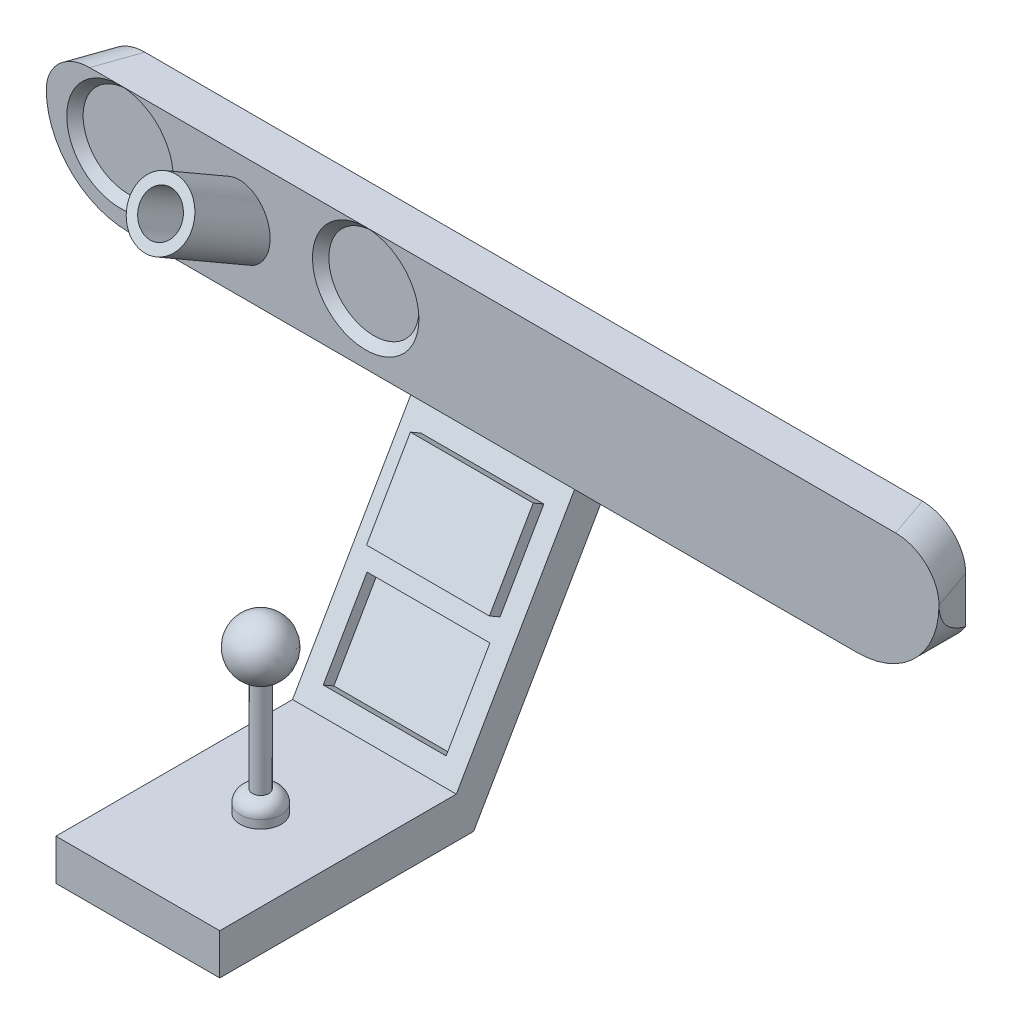
ISO-10303-21;
HEADER;
FILE_DESCRIPTION(('STEP AP214'),'2;1');
FILE_NAME('part.step','',(''),(''),'','','');
FILE_SCHEMA(('AUTOMOTIVE_DESIGN { 1 0 10303 214 1 1 1 1 }'));
ENDSEC;
DATA;
#1=APPLICATION_CONTEXT('core data for automotive mechanical design processes');
#2=APPLICATION_PROTOCOL_DEFINITION('international standard','automotive_design',2000,#1);
#3=PRODUCT_CONTEXT('',#1,'mechanical');
#4=PRODUCT('Part','Part','',(#3));
#5=PRODUCT_RELATED_PRODUCT_CATEGORY('part','',(#4));
#6=PRODUCT_DEFINITION_FORMATION('','',#4);
#7=PRODUCT_DEFINITION_CONTEXT('part definition',#1,'design');
#8=PRODUCT_DEFINITION('design','',#6,#7);
#9=PRODUCT_DEFINITION_SHAPE('','',#8);
#10=(LENGTH_UNIT() NAMED_UNIT(*) SI_UNIT(.MILLI.,.METRE.));
#11=(NAMED_UNIT(*) PLANE_ANGLE_UNIT() SI_UNIT($,.RADIAN.));
#12=(NAMED_UNIT(*) SI_UNIT($,.STERADIAN.) SOLID_ANGLE_UNIT());
#13=UNCERTAINTY_MEASURE_WITH_UNIT(LENGTH_MEASURE(1.E-05),#10,'distance_accuracy_value','');
#14=(GEOMETRIC_REPRESENTATION_CONTEXT(3) GLOBAL_UNCERTAINTY_ASSIGNED_CONTEXT((#13)) GLOBAL_UNIT_ASSIGNED_CONTEXT((#10,
#11,#12)) REPRESENTATION_CONTEXT('',''));
#15=CARTESIAN_POINT('',(0.,0.,0.));
#16=DIRECTION('',(0.,0.,1.));
#17=DIRECTION('',(1.,0.,0.));
#18=AXIS2_PLACEMENT_3D('',#15,#16,#17);
#19=CARTESIAN_POINT('',(20.,-15.,5.));
#20=DIRECTION('',(0.,-0.499999999999998,-0.86602540378444));
#21=DIRECTION('',(0.,0.86602540378444,-0.499999999999998));
#22=AXIS2_PLACEMENT_3D('',#19,#20,#21);
#23=PLANE('',#22);
#24=DIRECTION('',(0.,0.86602540378444,-0.499999999999998));
#25=VECTOR('',#24,1.);
#26=CARTESIAN_POINT('',(15.,-1.58493649053887,-2.74519052838325));
#27=LINE('',#26,#25);
#28=CARTESIAN_POINT('',(15.,-37.8630706599092,18.1999999999999));
#29=VERTEX_POINT('',#28);
#30=CARTESIAN_POINT('',(15.,-19.3301270189222,7.49999999999999));
#31=VERTEX_POINT('',#30);
#32=EDGE_CURVE('E364',#29,#31,#27,.T.);
#33=ORIENTED_EDGE('',*,*,#32,.F.);
#34=DIRECTION('',(1.,0.,0.));
#35=VECTOR('',#34,1.);
#36=CARTESIAN_POINT('',(0.,-37.8630706599092,18.1999999999999));
#37=LINE('',#36,#35);
#38=CARTESIAN_POINT('',(-15.,-37.8630706599092,18.1999999999999));
#39=VERTEX_POINT('',#38);
#40=EDGE_CURVE('E342',#39,#29,#37,.T.);
#41=ORIENTED_EDGE('',*,*,#40,.F.);
#42=DIRECTION('',(0.,0.86602540378444,-0.499999999999998));
#43=VECTOR('',#42,1.);
#44=CARTESIAN_POINT('',(-15.,-1.58493649053887,-2.74519052838325));
#45=LINE('',#44,#43);
#46=CARTESIAN_POINT('',(-15.,-19.3301270189222,7.5));
#47=VERTEX_POINT('',#46);
#48=EDGE_CURVE('E353',#39,#47,#45,.T.);
#49=ORIENTED_EDGE('',*,*,#48,.T.);
#50=DIRECTION('',(1.,0.,0.));
#51=VECTOR('',#50,1.);
#52=CARTESIAN_POINT('',(0.,-19.3301270189222,7.49999999999999));
#53=LINE('',#52,#51);
#54=EDGE_CURVE('E366',#47,#31,#53,.T.);
#55=ORIENTED_EDGE('',*,*,#54,.T.);
#56=EDGE_LOOP('',(#33,#41,#49,#55));
#57=FACE_BOUND('',#56,.T.);
#58=DIRECTION('',(0.,-0.86602540378444,0.499999999999998));
#59=VECTOR('',#58,1.);
#60=CARTESIAN_POINT('',(-20.,-15.,5.));
#61=LINE('',#60,#59);
#62=CARTESIAN_POINT('',(-20.,-15.,5.));
#63=VERTEX_POINT('',#62);
#64=CARTESIAN_POINT('',(-20.,-65.,33.8675134594811));
#65=VERTEX_POINT('',#64);
#66=EDGE_CURVE('E400',#63,#65,#61,.T.);
#67=ORIENTED_EDGE('',*,*,#66,.T.);
#68=DIRECTION('',(-1.,0.,0.));
#69=VECTOR('',#68,1.);
#70=CARTESIAN_POINT('',(20.,-65.,33.8675134594811));
#71=LINE('',#70,#69);
#72=CARTESIAN_POINT('',(20.,-65.,33.8675134594811));
#73=VERTEX_POINT('',#72);
#74=EDGE_CURVE('E415',#73,#65,#71,.T.);
#75=ORIENTED_EDGE('',*,*,#74,.F.);
#76=DIRECTION('',(0.,-0.86602540378444,0.499999999999998));
#77=VECTOR('',#76,1.);
#78=CARTESIAN_POINT('',(20.,-15.,5.));
#79=LINE('',#78,#77);
#80=CARTESIAN_POINT('',(20.,-15.,5.));
#81=VERTEX_POINT('',#80);
#82=EDGE_CURVE('E387',#81,#73,#79,.T.);
#83=ORIENTED_EDGE('',*,*,#82,.F.);
#84=DIRECTION('',(-1.,0.,0.));
#85=VECTOR('',#84,1.);
#86=CARTESIAN_POINT('',(20.,-15.,5.));
#87=LINE('',#86,#85);
#88=EDGE_CURVE('E418',#81,#63,#87,.T.);
#89=ORIENTED_EDGE('',*,*,#88,.T.);
#90=EDGE_LOOP('',(#67,#75,#83,#89));
#91=FACE_BOUND('',#90,.T.);
#92=DIRECTION('',(0.,0.86602540378444,-0.499999999999998));
#93=VECTOR('',#92,1.);
#94=CARTESIAN_POINT('',(-15.,-1.58493649053887,-2.74519052838324));
#95=LINE('',#94,#93);
#96=CARTESIAN_POINT('',(-15.,-60.6698729810778,31.3675134594811));
#97=VERTEX_POINT('',#96);
#98=CARTESIAN_POINT('',(-15.,-42.1369293400908,20.6675134594812));
#99=VERTEX_POINT('',#98);
#100=EDGE_CURVE('E315',#97,#99,#95,.T.);
#101=ORIENTED_EDGE('',*,*,#100,.T.);
#102=DIRECTION('',(-1.,0.,0.));
#103=VECTOR('',#102,1.);
#104=CARTESIAN_POINT('',(0.,-42.1369293400908,20.6675134594812));
#105=LINE('',#104,#103);
#106=CARTESIAN_POINT('',(15.,-42.1369293400908,20.6675134594812));
#107=VERTEX_POINT('',#106);
#108=EDGE_CURVE('E321',#107,#99,#105,.T.);
#109=ORIENTED_EDGE('',*,*,#108,.F.);
#110=DIRECTION('',(0.,0.86602540378444,-0.499999999999998));
#111=VECTOR('',#110,1.);
#112=CARTESIAN_POINT('',(15.,-1.58493649053887,-2.74519052838325));
#113=LINE('',#112,#111);
#114=CARTESIAN_POINT('',(15.,-60.6698729810778,31.3675134594811));
#115=VERTEX_POINT('',#114);
#116=EDGE_CURVE('E335',#115,#107,#113,.T.);
#117=ORIENTED_EDGE('',*,*,#116,.F.);
#118=DIRECTION('',(-1.,0.,0.));
#119=VECTOR('',#118,1.);
#120=CARTESIAN_POINT('',(0.,-60.6698729810778,31.3675134594811));
#121=LINE('',#120,#119);
#122=EDGE_CURVE('E332',#115,#97,#121,.T.);
#123=ORIENTED_EDGE('',*,*,#122,.T.);
#124=EDGE_LOOP('',(#101,#109,#117,#123));
#125=FACE_BOUND('',#124,.T.);
#126=ADVANCED_FACE('F62',(#57,#91,#125),#23,.F.);
#127=CARTESIAN_POINT('',(109.,-15.,5.));
#128=DIRECTION('',(0.,1.,0.));
#129=DIRECTION('',(-1.,0.,0.));
#130=AXIS2_PLACEMENT_3D('',#127,#128,#129);
#131=PLANE('',#130);
#132=DIRECTION('',(0.,0.,1.));
#133=VECTOR('',#132,1.);
#134=CARTESIAN_POINT('',(20.,-15.,-5.));
#135=LINE('',#134,#133);
#136=CARTESIAN_POINT('',(20.,-15.,-5.));
#137=VERTEX_POINT('',#136);
#138=EDGE_CURVE('E383',#137,#81,#135,.T.);
#139=ORIENTED_EDGE('',*,*,#138,.F.);
#140=DIRECTION('',(1.,0.,0.));
#141=VECTOR('',#140,1.);
#142=CARTESIAN_POINT('',(109.,-15.,-5.));
#143=LINE('',#142,#141);
#144=CARTESIAN_POINT('',(89.,-15.,-5.));
#145=VERTEX_POINT('',#144);
#146=EDGE_CURVE('E438',#137,#145,#143,.T.);
#147=ORIENTED_EDGE('',*,*,#146,.T.);
#148=DIRECTION('',(0.,0.,-1.));
#149=VECTOR('',#148,1.);
#150=CARTESIAN_POINT('',(89.,-15.,5.));
#151=LINE('',#150,#149);
#152=CARTESIAN_POINT('',(89.,-15.,5.));
#153=VERTEX_POINT('',#152);
#154=EDGE_CURVE('E234',#145,#153,#151,.F.);
#155=ORIENTED_EDGE('',*,*,#154,.T.);
#156=DIRECTION('',(1.,0.,0.));
#157=VECTOR('',#156,1.);
#158=CARTESIAN_POINT('',(109.,-15.,5.));
#159=LINE('',#158,#157);
#160=EDGE_CURVE('E441',#81,#153,#159,.T.);
#161=ORIENTED_EDGE('',*,*,#160,.F.);
#162=EDGE_LOOP('',(#139,#147,#155,#161));
#163=FACE_BOUND('',#162,.T.);
#164=ADVANCED_FACE('F450',(#163),#131,.F.);
#165=CARTESIAN_POINT('',(-89.,-15.,-5.));
#166=VERTEX_POINT('',#165);
#167=CARTESIAN_POINT('',(-20.,-15.,-5.));
#168=VERTEX_POINT('',#167);
#169=EDGE_CURVE('E445',#166,#168,#143,.T.);
#170=ORIENTED_EDGE('',*,*,#169,.T.);
#171=DIRECTION('',(0.,0.,1.));
#172=VECTOR('',#171,1.);
#173=CARTESIAN_POINT('',(-20.,-15.,-5.));
#174=LINE('',#173,#172);
#175=EDGE_CURVE('E398',#168,#63,#174,.T.);
#176=ORIENTED_EDGE('',*,*,#175,.T.);
#177=CARTESIAN_POINT('',(-89.,-15.,5.));
#178=VERTEX_POINT('',#177);
#179=EDGE_CURVE('E439',#178,#63,#159,.T.);
#180=ORIENTED_EDGE('',*,*,#179,.F.);
#181=DIRECTION('',(0.,0.,-1.));
#182=VECTOR('',#181,1.);
#183=CARTESIAN_POINT('',(-89.,-15.,5.));
#184=LINE('',#183,#182);
#185=EDGE_CURVE('E236',#178,#166,#184,.T.);
#186=ORIENTED_EDGE('',*,*,#185,.T.);
#187=EDGE_LOOP('',(#170,#176,#180,#186));
#188=FACE_BOUND('',#187,.T.);
#189=ADVANCED_FACE('F481',(#188),#131,.F.);
#190=CARTESIAN_POINT('',(109.,15.,5.));
#191=DIRECTION('',(0.,-1.,0.));
#192=DIRECTION('',(1.,0.,0.));
#193=AXIS2_PLACEMENT_3D('',#190,#191,#192);
#194=PLANE('',#193);
#195=DIRECTION('',(-1.,0.,0.));
#196=VECTOR('',#195,1.);
#197=CARTESIAN_POINT('',(109.,15.,5.));
#198=LINE('',#197,#196);
#199=CARTESIAN_POINT('',(98.4117801307302,15.,5.));
#200=VERTEX_POINT('',#199);
#201=CARTESIAN_POINT('',(-31.,15.,5.));
#202=VERTEX_POINT('',#201);
#203=EDGE_CURVE('E442',#200,#202,#198,.T.);
#204=ORIENTED_EDGE('',*,*,#203,.F.);
#205=DIRECTION('',(0.328667145466067,0.,0.94444582030479));
#206=VECTOR('',#205,1.);
#207=CARTESIAN_POINT('',(99.5555417969521,15.,8.28667145466067));
#208=LINE('',#207,#206);
#209=CARTESIAN_POINT('',(94.9317801307302,15.,-5.));
#210=VERTEX_POINT('',#209);
#211=EDGE_CURVE('E70',#200,#210,#208,.F.);
#212=ORIENTED_EDGE('',*,*,#211,.T.);
#213=DIRECTION('',(-1.,0.,0.));
#214=VECTOR('',#213,1.);
#215=CARTESIAN_POINT('',(109.,15.,-5.));
#216=LINE('',#215,#214);
#217=CARTESIAN_POINT('',(-94.9317801307302,15.,-5.));
#218=VERTEX_POINT('',#217);
#219=EDGE_CURVE('E299',#210,#218,#216,.T.);
#220=ORIENTED_EDGE('',*,*,#219,.T.);
#221=DIRECTION('',(0.328667145466067,0.,-0.94444582030479));
#222=VECTOR('',#221,1.);
#223=CARTESIAN_POINT('',(-76.006725630031,15.,-59.3823405192507));
#224=LINE('',#223,#222);
#225=CARTESIAN_POINT('',(-98.4117801307302,15.,5.));
#226=VERTEX_POINT('',#225);
#227=EDGE_CURVE('E276',#218,#226,#224,.F.);
#228=ORIENTED_EDGE('',*,*,#227,.T.);
#229=CARTESIAN_POINT('',(-91.,15.,5.));
#230=VERTEX_POINT('',#229);
#231=EDGE_CURVE('E287',#230,#226,#198,.T.);
#232=ORIENTED_EDGE('',*,*,#231,.F.);
#233=EDGE_CURVE('E444',#202,#230,#198,.T.);
#234=ORIENTED_EDGE('',*,*,#233,.F.);
#235=EDGE_LOOP('',(#204,#212,#220,#228,#232,#234));
#236=FACE_BOUND('',#235,.T.);
#237=ADVANCED_FACE('F538',(#236),#194,.F.);
#238=CARTESIAN_POINT('',(0.,0.,5.));
#239=DIRECTION('',(0.,0.,1.));
#240=DIRECTION('',(1.,0.,0.));
#241=AXIS2_PLACEMENT_3D('',#238,#239,#240);
#242=PLANE('',#241);
#243=CARTESIAN_POINT('',(-61.85,0.886751345948124,5.));
#244=DIRECTION('',(0.,0.,1.));
#245=DIRECTION('',(0.,1.,0.));
#246=AXIS2_PLACEMENT_3D('',#243,#244,#245);
#247=ELLIPSE('',#246,8.66025403784437,7.5);
#248=CARTESIAN_POINT('',(-61.85,9.5470053837925,5.));
#249=VERTEX_POINT('',#248);
#250=EDGE_CURVE('E435',#249,#249,#247,.F.);
#251=ORIENTED_EDGE('',*,*,#250,.T.);
#252=EDGE_LOOP('',(#251));
#253=FACE_BOUND('',#252,.T.);
#254=CARTESIAN_POINT('',(89.,5.00000000000001,5.));
#255=DIRECTION('',(0.,0.,1.));
#256=DIRECTION('',(1.,0.,0.));
#257=AXIS2_PLACEMENT_3D('',#254,#255,#256);
#258=CIRCLE('',#257,20.);
#259=CARTESIAN_POINT('',(109.,5.00000000000001,5.));
#260=VERTEX_POINT('',#259);
#261=EDGE_CURVE('E239',#153,#260,#258,.T.);
#262=ORIENTED_EDGE('',*,*,#261,.T.);
#263=CARTESIAN_POINT('',(98.4117801307302,5.00000000000001,5.));
#264=DIRECTION('',(0.,0.,1.));
#265=DIRECTION('',(1.,0.,0.));
#266=AXIS2_PLACEMENT_3D('',#263,#264,#265);
#267=ELLIPSE('',#266,10.5882198692698,10.);
#268=EDGE_CURVE('E84',#260,#200,#267,.T.);
#269=ORIENTED_EDGE('',*,*,#268,.T.);
#270=ORIENTED_EDGE('',*,*,#203,.T.);
#271=CARTESIAN_POINT('',(-31.,2.00000000000001,5.));
#272=DIRECTION('',(0.,0.,1.));
#273=DIRECTION('',(1.,0.,0.));
#274=AXIS2_PLACEMENT_3D('',#271,#272,#273);
#275=CIRCLE('',#274,13.);
#276=EDGE_CURVE('E251',#202,#202,#275,.F.);
#277=ORIENTED_EDGE('',*,*,#276,.T.);
#278=ORIENTED_EDGE('',*,*,#233,.T.);
#279=CARTESIAN_POINT('',(-91.,2.00000000000001,5.));
#280=DIRECTION('',(0.,0.,1.));
#281=DIRECTION('',(1.,0.,0.));
#282=AXIS2_PLACEMENT_3D('',#279,#280,#281);
#283=CIRCLE('',#282,13.);
#284=EDGE_CURVE('E248',#230,#230,#283,.F.);
#285=ORIENTED_EDGE('',*,*,#284,.T.);
#286=ORIENTED_EDGE('',*,*,#231,.T.);
#287=CARTESIAN_POINT('',(-98.4117801307302,4.99999999999998,5.));
#288=DIRECTION('',(0.,0.,1.));
#289=DIRECTION('',(1.,0.,0.));
#290=AXIS2_PLACEMENT_3D('',#287,#288,#289);
#291=ELLIPSE('',#290,10.5882198692698,10.);
#292=CARTESIAN_POINT('',(-109.,4.99999999999999,5.));
#293=VERTEX_POINT('',#292);
#294=EDGE_CURVE('E222',#226,#293,#291,.T.);
#295=ORIENTED_EDGE('',*,*,#294,.T.);
#296=CARTESIAN_POINT('',(-89.,4.99999999999999,5.));
#297=DIRECTION('',(0.,0.,1.));
#298=DIRECTION('',(1.,0.,0.));
#299=AXIS2_PLACEMENT_3D('',#296,#297,#298);
#300=CIRCLE('',#299,20.);
#301=EDGE_CURVE('E246',#293,#178,#300,.T.);
#302=ORIENTED_EDGE('',*,*,#301,.T.);
#303=ORIENTED_EDGE('',*,*,#179,.T.);
#304=ORIENTED_EDGE('',*,*,#88,.F.);
#305=ORIENTED_EDGE('',*,*,#160,.T.);
#306=EDGE_LOOP('',(#262,#269,#270,#277,#278,#285,#286,#295,#302,#303,#304,#305));
#307=FACE_BOUND('',#306,.T.);
#308=ADVANCED_FACE('F282',(#253,#307),#242,.T.);
#309=CARTESIAN_POINT('',(0.,0.,-5.));
#310=DIRECTION('',(0.,0.,1.));
#311=DIRECTION('',(1.,0.,0.));
#312=AXIS2_PLACEMENT_3D('',#309,#310,#311);
#313=PLANE('',#312);
#314=CARTESIAN_POINT('',(-61.85,-4.8867513459481,-5.));
#315=DIRECTION('',(0.,0.,1.));
#316=DIRECTION('',(0.,1.,0.));
#317=AXIS2_PLACEMENT_3D('',#314,#315,#316);
#318=ELLIPSE('',#317,8.66025403784437,7.5);
#319=CARTESIAN_POINT('',(-61.85,3.77350269189627,-5.));
#320=VERTEX_POINT('',#319);
#321=EDGE_CURVE('E260',#320,#320,#318,.F.);
#322=ORIENTED_EDGE('',*,*,#321,.F.);
#323=EDGE_LOOP('',(#322));
#324=FACE_BOUND('',#323,.T.);
#325=ORIENTED_EDGE('',*,*,#219,.F.);
#326=CARTESIAN_POINT('',(94.9317801307302,5.00000000000001,-5.));
#327=DIRECTION('',(0.,0.,1.));
#328=DIRECTION('',(1.,0.,0.));
#329=AXIS2_PLACEMENT_3D('',#326,#327,#328);
#330=ELLIPSE('',#329,10.5882198692698,10.);
#331=CARTESIAN_POINT('',(105.52,5.00000000000001,-5.));
#332=VERTEX_POINT('',#331);
#333=EDGE_CURVE('E12',#210,#332,#330,.F.);
#334=ORIENTED_EDGE('',*,*,#333,.T.);
#335=DIRECTION('',(0.,1.,0.));
#336=VECTOR('',#335,1.);
#337=CARTESIAN_POINT('',(105.52,-25.,-5.));
#338=LINE('',#337,#336);
#339=CARTESIAN_POINT('',(105.52,-6.27340232582868,-5.));
#340=VERTEX_POINT('',#339);
#341=EDGE_CURVE('E216',#340,#332,#338,.T.);
#342=ORIENTED_EDGE('',*,*,#341,.F.);
#343=CARTESIAN_POINT('',(89.,5.00000000000001,-5.));
#344=DIRECTION('',(0.,0.,1.));
#345=DIRECTION('',(1.,0.,0.));
#346=AXIS2_PLACEMENT_3D('',#343,#344,#345);
#347=CIRCLE('',#346,20.);
#348=EDGE_CURVE('E226',#340,#145,#347,.F.);
#349=ORIENTED_EDGE('',*,*,#348,.T.);
#350=ORIENTED_EDGE('',*,*,#146,.F.);
#351=DIRECTION('',(-1.,0.,0.));
#352=VECTOR('',#351,1.);
#353=CARTESIAN_POINT('',(20.,-15.,-5.));
#354=LINE('',#353,#352);
#355=EDGE_CURVE('E421',#137,#168,#354,.T.);
#356=ORIENTED_EDGE('',*,*,#355,.T.);
#357=ORIENTED_EDGE('',*,*,#169,.F.);
#358=CARTESIAN_POINT('',(-89.,4.99999999999999,-5.));
#359=DIRECTION('',(0.,0.,1.));
#360=DIRECTION('',(1.,0.,0.));
#361=AXIS2_PLACEMENT_3D('',#358,#359,#360);
#362=CIRCLE('',#361,20.);
#363=CARTESIAN_POINT('',(-105.52,-6.27340232582872,-5.));
#364=VERTEX_POINT('',#363);
#365=EDGE_CURVE('E235',#166,#364,#362,.F.);
#366=ORIENTED_EDGE('',*,*,#365,.T.);
#367=DIRECTION('',(0.,1.,0.));
#368=VECTOR('',#367,1.);
#369=CARTESIAN_POINT('',(-105.52,-25.,-5.));
#370=LINE('',#369,#368);
#371=CARTESIAN_POINT('',(-105.52,4.99999999999998,-5.));
#372=VERTEX_POINT('',#371);
#373=EDGE_CURVE('E229',#364,#372,#370,.T.);
#374=ORIENTED_EDGE('',*,*,#373,.T.);
#375=CARTESIAN_POINT('',(-94.9317801307302,4.99999999999998,-5.));
#376=DIRECTION('',(0.,0.,1.));
#377=DIRECTION('',(1.,0.,0.));
#378=AXIS2_PLACEMENT_3D('',#375,#376,#377);
#379=ELLIPSE('',#378,10.5882198692698,10.);
#380=EDGE_CURVE('E273',#372,#218,#379,.F.);
#381=ORIENTED_EDGE('',*,*,#380,.T.);
#382=EDGE_LOOP('',(#325,#334,#342,#349,#350,#356,#357,#366,#374,#381));
#383=FACE_BOUND('',#382,.T.);
#384=ADVANCED_FACE('F225',(#324,#383),#313,.F.);
#385=CARTESIAN_POINT('',(-89.,4.99999999999999,5.));
#386=DIRECTION('',(0.,0.,-1.));
#387=DIRECTION('',(-1.,0.,0.));
#388=AXIS2_PLACEMENT_3D('',#385,#386,#387);
#389=CYLINDRICAL_SURFACE('',#388,20.);
#390=CARTESIAN_POINT('',(-89.,4.99999999999999,-52.4712643678161));
#391=DIRECTION('',(0.94444582030479,0.,0.328667145466067));
#392=DIRECTION('',(0.328667145466067,0.,-0.94444582030479));
#393=AXIS2_PLACEMENT_3D('',#390,#391,#392);
#394=ELLIPSE('',#393,60.8518383291369,20.);
#395=EDGE_CURVE('E267',#364,#293,#394,.F.);
#396=ORIENTED_EDGE('',*,*,#395,.F.);
#397=ORIENTED_EDGE('',*,*,#365,.F.);
#398=ORIENTED_EDGE('',*,*,#185,.F.);
#399=ORIENTED_EDGE('',*,*,#301,.F.);
#400=EDGE_LOOP('',(#396,#397,#398,#399));
#401=FACE_BOUND('',#400,.T.);
#402=ADVANCED_FACE('F297',(#401),#389,.T.);
#403=CARTESIAN_POINT('',(89.,5.00000000000001,5.));
#404=DIRECTION('',(0.,0.,-1.));
#405=DIRECTION('',(-1.,0.,0.));
#406=AXIS2_PLACEMENT_3D('',#403,#404,#405);
#407=CYLINDRICAL_SURFACE('',#406,20.);
#408=CARTESIAN_POINT('',(89.,5.00000000000001,-52.4712643678161));
#409=DIRECTION('',(-0.94444582030479,0.,0.328667145466067));
#410=DIRECTION('',(-0.328667145466067,0.,-0.94444582030479));
#411=AXIS2_PLACEMENT_3D('',#408,#409,#410);
#412=ELLIPSE('',#411,60.8518383291369,20.);
#413=EDGE_CURVE('E213',#260,#340,#412,.F.);
#414=ORIENTED_EDGE('',*,*,#413,.F.);
#415=ORIENTED_EDGE('',*,*,#261,.F.);
#416=ORIENTED_EDGE('',*,*,#154,.F.);
#417=ORIENTED_EDGE('',*,*,#348,.F.);
#418=EDGE_LOOP('',(#414,#415,#416,#417));
#419=FACE_BOUND('',#418,.T.);
#420=ADVANCED_FACE('F232',(#419),#407,.T.);
#421=CARTESIAN_POINT('',(-31.,2.00000000000001,3.));
#422=DIRECTION('',(0.,0.,1.));
#423=DIRECTION('',(1.,0.,0.));
#424=AXIS2_PLACEMENT_3D('',#421,#422,#423);
#425=PLANE('',#424);
#426=CARTESIAN_POINT('',(-31.,2.00000000000001,3.));
#427=DIRECTION('',(0.,0.,1.));
#428=DIRECTION('',(1.,0.,0.));
#429=AXIS2_PLACEMENT_3D('',#426,#427,#428);
#430=CIRCLE('',#429,11.);
#431=CARTESIAN_POINT('',(-20.,2.00000000000001,3.));
#432=VERTEX_POINT('',#431);
#433=EDGE_CURVE('E254',#432,#432,#430,.T.);
#434=ORIENTED_EDGE('',*,*,#433,.T.);
#435=EDGE_LOOP('',(#434));
#436=FACE_BOUND('',#435,.T.);
#437=ADVANCED_FACE('F531',(#436),#425,.T.);
#438=CARTESIAN_POINT('',(-91.,2.00000000000001,3.));
#439=DIRECTION('',(0.,0.,1.));
#440=DIRECTION('',(1.,0.,0.));
#441=AXIS2_PLACEMENT_3D('',#438,#439,#440);
#442=PLANE('',#441);
#443=CARTESIAN_POINT('',(-91.,2.00000000000001,3.));
#444=DIRECTION('',(0.,0.,1.));
#445=DIRECTION('',(1.,0.,0.));
#446=AXIS2_PLACEMENT_3D('',#443,#444,#445);
#447=CIRCLE('',#446,11.);
#448=CARTESIAN_POINT('',(-80.,2.00000000000001,3.));
#449=VERTEX_POINT('',#448);
#450=EDGE_CURVE('E257',#449,#449,#447,.T.);
#451=ORIENTED_EDGE('',*,*,#450,.T.);
#452=EDGE_LOOP('',(#451));
#453=FACE_BOUND('',#452,.T.);
#454=ADVANCED_FACE('F527',(#453),#442,.T.);
#455=CARTESIAN_POINT('',(-31.,2.00000000000001,1.99999999999995));
#456=DIRECTION('',(0.,0.,1.));
#457=DIRECTION('',(1.,0.,0.));
#458=AXIS2_PLACEMENT_3D('',#455,#456,#457);
#459=CONICAL_SURFACE('',#458,10.,0.785398163397443);
#460=ORIENTED_EDGE('',*,*,#276,.F.);
#461=EDGE_LOOP('',(#460));
#462=FACE_BOUND('',#461,.T.);
#463=ORIENTED_EDGE('',*,*,#433,.F.);
#464=EDGE_LOOP('',(#463));
#465=FACE_BOUND('',#464,.T.);
#466=ADVANCED_FACE('F530',(#462,#465),#459,.F.);
#467=CARTESIAN_POINT('',(-91.,2.00000000000001,1.99999999999995));
#468=DIRECTION('',(0.,0.,1.));
#469=DIRECTION('',(1.,0.,0.));
#470=AXIS2_PLACEMENT_3D('',#467,#468,#469);
#471=CONICAL_SURFACE('',#470,9.99999999999999,0.785398163397443);
#472=ORIENTED_EDGE('',*,*,#284,.F.);
#473=EDGE_LOOP('',(#472));
#474=FACE_BOUND('',#473,.T.);
#475=ORIENTED_EDGE('',*,*,#450,.F.);
#476=EDGE_LOOP('',(#475));
#477=FACE_BOUND('',#476,.T.);
#478=ADVANCED_FACE('F522',(#474,#477),#471,.F.);
#479=CARTESIAN_POINT('',(-61.85,-1.50480947161665,-14.1423048454133));
#480=DIRECTION('',(0.,0.499999999999998,0.86602540378444));
#481=DIRECTION('',(0.,-0.86602540378444,0.499999999999998));
#482=AXIS2_PLACEMENT_3D('',#479,#480,#481);
#483=PLANE('',#482);
#484=CARTESIAN_POINT('',(-61.85,-7.99999999999996,-10.3923048454133));
#485=DIRECTION('',(0.,0.499999999999998,0.86602540378444));
#486=DIRECTION('',(0.,-0.86602540378444,0.499999999999998));
#487=AXIS2_PLACEMENT_3D('',#484,#485,#486);
#488=CIRCLE('',#487,5.);
#489=CARTESIAN_POINT('',(-61.85,-12.3301270189222,-7.89230484541328));
#490=VERTEX_POINT('',#489);
#491=EDGE_CURVE('E426',#490,#490,#488,.T.);
#492=ORIENTED_EDGE('',*,*,#491,.T.);
#493=EDGE_LOOP('',(#492));
#494=FACE_BOUND('',#493,.T.);
#495=CARTESIAN_POINT('',(-61.85,-7.99999999999996,-10.3923048454133));
#496=DIRECTION('',(0.,0.499999999999998,0.86602540378444));
#497=DIRECTION('',(0.,-0.86602540378444,0.499999999999998));
#498=AXIS2_PLACEMENT_3D('',#495,#496,#497);
#499=CIRCLE('',#498,7.50000000000001);
#500=CARTESIAN_POINT('',(-61.85,-14.4951905283833,-6.64230484541329));
#501=VERTEX_POINT('',#500);
#502=EDGE_CURVE('E432',#501,#501,#499,.T.);
#503=ORIENTED_EDGE('',*,*,#502,.F.);
#504=EDGE_LOOP('',(#503));
#505=FACE_BOUND('',#504,.T.);
#506=ADVANCED_FACE('F518',(#494,#505),#483,.F.);
#507=CARTESIAN_POINT('',(-61.85,12.,24.2487113059643));
#508=DIRECTION('',(0.,0.499999999999998,0.86602540378444));
#509=DIRECTION('',(0.,-0.86602540378444,0.499999999999998));
#510=AXIS2_PLACEMENT_3D('',#507,#508,#509);
#511=CYLINDRICAL_SURFACE('',#510,7.5);
#512=ORIENTED_EDGE('',*,*,#502,.T.);
#513=EDGE_LOOP('',(#512));
#514=FACE_BOUND('',#513,.T.);
#515=ORIENTED_EDGE('',*,*,#321,.T.);
#516=EDGE_LOOP('',(#515));
#517=FACE_BOUND('',#516,.T.);
#518=ADVANCED_FACE('F521',(#514,#517),#511,.T.);
#519=ORIENTED_EDGE('',*,*,#250,.F.);
#520=EDGE_LOOP('',(#519));
#521=FACE_BOUND('',#520,.T.);
#522=CARTESIAN_POINT('',(-61.85,12.,24.2487113059643));
#523=DIRECTION('',(0.,0.499999999999998,0.86602540378444));
#524=DIRECTION('',(0.,-0.86602540378444,0.499999999999998));
#525=AXIS2_PLACEMENT_3D('',#522,#523,#524);
#526=CIRCLE('',#525,7.5);
#527=CARTESIAN_POINT('',(-61.85,5.50480947161665,27.9987113059643));
#528=VERTEX_POINT('',#527);
#529=EDGE_CURVE('E429',#528,#528,#526,.T.);
#530=ORIENTED_EDGE('',*,*,#529,.F.);
#531=EDGE_LOOP('',(#530));
#532=FACE_BOUND('',#531,.T.);
#533=ADVANCED_FACE('F516',(#521,#532),#511,.T.);
#534=CARTESIAN_POINT('',(-61.85,18.4951905283832,20.4987113059643));
#535=DIRECTION('',(0.,-0.499999999999998,-0.86602540378444));
#536=DIRECTION('',(0.,0.86602540378444,-0.499999999999998));
#537=AXIS2_PLACEMENT_3D('',#534,#535,#536);
#538=PLANE('',#537);
#539=CARTESIAN_POINT('',(-61.85,12.,24.2487113059643));
#540=DIRECTION('',(0.,0.499999999999998,0.86602540378444));
#541=DIRECTION('',(0.,-0.86602540378444,0.499999999999998));
#542=AXIS2_PLACEMENT_3D('',#539,#540,#541);
#543=CIRCLE('',#542,5.);
#544=CARTESIAN_POINT('',(-61.85,7.66987298107776,26.7487113059643));
#545=VERTEX_POINT('',#544);
#546=EDGE_CURVE('E423',#545,#545,#543,.T.);
#547=ORIENTED_EDGE('',*,*,#546,.F.);
#548=EDGE_LOOP('',(#547));
#549=FACE_BOUND('',#548,.T.);
#550=ORIENTED_EDGE('',*,*,#529,.T.);
#551=EDGE_LOOP('',(#550));
#552=FACE_BOUND('',#551,.T.);
#553=ADVANCED_FACE('F512',(#549,#552),#538,.F.);
#554=CARTESIAN_POINT('',(-61.85,-11.3737976320958,-16.2358937586588));
#555=DIRECTION('',(0.,0.499999999999998,0.86602540378444));
#556=DIRECTION('',(0.,-0.86602540378444,0.499999999999998));
#557=AXIS2_PLACEMENT_3D('',#554,#555,#556);
#558=CYLINDRICAL_SURFACE('',#557,5.);
#559=ORIENTED_EDGE('',*,*,#546,.T.);
#560=EDGE_LOOP('',(#559));
#561=FACE_BOUND('',#560,.T.);
#562=ORIENTED_EDGE('',*,*,#491,.F.);
#563=EDGE_LOOP('',(#562));
#564=FACE_BOUND('',#563,.T.);
#565=ADVANCED_FACE('F509',(#561,#564),#558,.F.);
#566=CARTESIAN_POINT('',(20.,-15.,-5.));
#567=DIRECTION('',(0.,0.499999999999998,0.86602540378444));
#568=DIRECTION('',(0.,-0.86602540378444,0.499999999999998));
#569=AXIS2_PLACEMENT_3D('',#566,#567,#568);
#570=PLANE('',#569);
#571=DIRECTION('',(0.,0.86602540378444,-0.499999999999998));
#572=VECTOR('',#571,1.);
#573=CARTESIAN_POINT('',(-20.,-15.,-5.));
#574=LINE('',#573,#572);
#575=CARTESIAN_POINT('',(-20.,-75.,29.6410161513773));
#576=VERTEX_POINT('',#575);
#577=EDGE_CURVE('E379',#576,#168,#574,.T.);
#578=ORIENTED_EDGE('',*,*,#577,.T.);
#579=ORIENTED_EDGE('',*,*,#355,.F.);
#580=DIRECTION('',(0.,0.86602540378444,-0.499999999999998));
#581=VECTOR('',#580,1.);
#582=CARTESIAN_POINT('',(20.,-15.,-5.));
#583=LINE('',#582,#581);
#584=CARTESIAN_POINT('',(20.,-75.,29.6410161513773));
#585=VERTEX_POINT('',#584);
#586=EDGE_CURVE('E380',#585,#137,#583,.T.);
#587=ORIENTED_EDGE('',*,*,#586,.F.);
#588=DIRECTION('',(-1.,0.,0.));
#589=VECTOR('',#588,1.);
#590=CARTESIAN_POINT('',(20.,-75.,29.6410161513773));
#591=LINE('',#590,#589);
#592=EDGE_CURVE('E395',#585,#576,#591,.T.);
#593=ORIENTED_EDGE('',*,*,#592,.T.);
#594=EDGE_LOOP('',(#578,#579,#587,#593));
#595=FACE_BOUND('',#594,.T.);
#596=ADVANCED_FACE('F478',(#595),#570,.F.);
#597=CARTESIAN_POINT('',(20.,-65.,33.8675134594811));
#598=DIRECTION('',(0.,-1.,0.));
#599=DIRECTION('',(0.,0.,-1.));
#600=AXIS2_PLACEMENT_3D('',#597,#598,#599);
#601=PLANE('',#600);
#602=CARTESIAN_POINT('',(0.,-65.,61.6410161513773));
#603=DIRECTION('',(0.,-1.,0.));
#604=DIRECTION('',(0.,0.,-1.));
#605=AXIS2_PLACEMENT_3D('',#602,#603,#604);
#606=CIRCLE('',#605,5.);
#607=CARTESIAN_POINT('',(0.,-65.,56.6410161513773));
#608=VERTEX_POINT('',#607);
#609=EDGE_CURVE('E266',#608,#608,#606,.F.);
#610=ORIENTED_EDGE('',*,*,#609,.F.);
#611=EDGE_LOOP('',(#610));
#612=FACE_BOUND('',#611,.T.);
#613=DIRECTION('',(0.,0.,1.));
#614=VECTOR('',#613,1.);
#615=CARTESIAN_POINT('',(-20.,-65.,33.8675134594811));
#616=LINE('',#615,#614);
#617=CARTESIAN_POINT('',(-20.,-65.,91.6410161513773));
#618=VERTEX_POINT('',#617);
#619=EDGE_CURVE('E402',#65,#618,#616,.T.);
#620=ORIENTED_EDGE('',*,*,#619,.T.);
#621=DIRECTION('',(-1.,0.,0.));
#622=VECTOR('',#621,1.);
#623=CARTESIAN_POINT('',(20.,-65.,91.6410161513773));
#624=LINE('',#623,#622);
#625=CARTESIAN_POINT('',(20.,-65.,91.6410161513773));
#626=VERTEX_POINT('',#625);
#627=EDGE_CURVE('E412',#626,#618,#624,.T.);
#628=ORIENTED_EDGE('',*,*,#627,.F.);
#629=DIRECTION('',(0.,0.,1.));
#630=VECTOR('',#629,1.);
#631=CARTESIAN_POINT('',(20.,-65.,33.8675134594811));
#632=LINE('',#631,#630);
#633=EDGE_CURVE('E389',#73,#626,#632,.T.);
#634=ORIENTED_EDGE('',*,*,#633,.F.);
#635=ORIENTED_EDGE('',*,*,#74,.T.);
#636=EDGE_LOOP('',(#620,#628,#634,#635));
#637=FACE_BOUND('',#636,.T.);
#638=ADVANCED_FACE('F465',(#612,#637),#601,.F.);
#639=CARTESIAN_POINT('',(20.,-65.,91.6410161513773));
#640=DIRECTION('',(0.,0.,-1.));
#641=DIRECTION('',(0.,1.,0.));
#642=AXIS2_PLACEMENT_3D('',#639,#640,#641);
#643=PLANE('',#642);
#644=DIRECTION('',(0.,-1.,0.));
#645=VECTOR('',#644,1.);
#646=CARTESIAN_POINT('',(-20.,-65.,91.6410161513773));
#647=LINE('',#646,#645);
#648=CARTESIAN_POINT('',(-20.,-75.,91.6410161513773));
#649=VERTEX_POINT('',#648);
#650=EDGE_CURVE('E404',#618,#649,#647,.T.);
#651=ORIENTED_EDGE('',*,*,#650,.T.);
#652=DIRECTION('',(-1.,0.,0.));
#653=VECTOR('',#652,1.);
#654=CARTESIAN_POINT('',(20.,-75.,91.6410161513773));
#655=LINE('',#654,#653);
#656=CARTESIAN_POINT('',(20.,-75.,91.6410161513773));
#657=VERTEX_POINT('',#656);
#658=EDGE_CURVE('E409',#657,#649,#655,.T.);
#659=ORIENTED_EDGE('',*,*,#658,.F.);
#660=DIRECTION('',(0.,-1.,0.));
#661=VECTOR('',#660,1.);
#662=CARTESIAN_POINT('',(20.,-65.,91.6410161513773));
#663=LINE('',#662,#661);
#664=EDGE_CURVE('E391',#626,#657,#663,.T.);
#665=ORIENTED_EDGE('',*,*,#664,.F.);
#666=ORIENTED_EDGE('',*,*,#627,.T.);
#667=EDGE_LOOP('',(#651,#659,#665,#666));
#668=FACE_BOUND('',#667,.T.);
#669=ADVANCED_FACE('F471',(#668),#643,.F.);
#670=CARTESIAN_POINT('',(20.,-75.,29.6410161513773));
#671=DIRECTION('',(0.,1.,0.));
#672=DIRECTION('',(0.,0.,1.));
#673=AXIS2_PLACEMENT_3D('',#670,#671,#672);
#674=PLANE('',#673);
#675=CARTESIAN_POINT('',(0.,-75.,61.6410161513773));
#676=DIRECTION('',(0.,1.,0.));
#677=DIRECTION('',(0.,0.,1.));
#678=AXIS2_PLACEMENT_3D('',#675,#676,#677);
#679=CIRCLE('',#678,7.5);
#680=CARTESIAN_POINT('',(0.,-75.,69.1410161513773));
#681=VERTEX_POINT('',#680);
#682=EDGE_CURVE('E263',#681,#681,#679,.F.);
#683=ORIENTED_EDGE('',*,*,#682,.F.);
#684=EDGE_LOOP('',(#683));
#685=FACE_BOUND('',#684,.T.);
#686=DIRECTION('',(0.,0.,-1.));
#687=VECTOR('',#686,1.);
#688=CARTESIAN_POINT('',(-20.,-75.,29.6410161513773));
#689=LINE('',#688,#687);
#690=EDGE_CURVE('E384',#649,#576,#689,.T.);
#691=ORIENTED_EDGE('',*,*,#690,.T.);
#692=ORIENTED_EDGE('',*,*,#592,.F.);
#693=DIRECTION('',(0.,0.,-1.));
#694=VECTOR('',#693,1.);
#695=CARTESIAN_POINT('',(20.,-75.,29.6410161513773));
#696=LINE('',#695,#694);
#697=EDGE_CURVE('E393',#657,#585,#696,.T.);
#698=ORIENTED_EDGE('',*,*,#697,.F.);
#699=ORIENTED_EDGE('',*,*,#658,.T.);
#700=EDGE_LOOP('',(#691,#692,#698,#699));
#701=FACE_BOUND('',#700,.T.);
#702=ADVANCED_FACE('F475',(#685,#701),#674,.F.);
#703=CARTESIAN_POINT('',(20.,0.,0.));
#704=DIRECTION('',(-1.,0.,0.));
#705=DIRECTION('',(0.,0.,1.));
#706=AXIS2_PLACEMENT_3D('',#703,#704,#705);
#707=PLANE('',#706);
#708=ORIENTED_EDGE('',*,*,#586,.T.);
#709=ORIENTED_EDGE('',*,*,#138,.T.);
#710=ORIENTED_EDGE('',*,*,#82,.T.);
#711=ORIENTED_EDGE('',*,*,#633,.T.);
#712=ORIENTED_EDGE('',*,*,#664,.T.);
#713=ORIENTED_EDGE('',*,*,#697,.T.);
#714=EDGE_LOOP('',(#708,#709,#710,#711,#712,#713));
#715=FACE_BOUND('',#714,.T.);
#716=ADVANCED_FACE('F456',(#715),#707,.F.);
#717=CARTESIAN_POINT('',(-20.,0.,0.));
#718=DIRECTION('',(-1.,0.,0.));
#719=DIRECTION('',(0.,0.,1.));
#720=AXIS2_PLACEMENT_3D('',#717,#718,#719);
#721=PLANE('',#720);
#722=ORIENTED_EDGE('',*,*,#577,.F.);
#723=ORIENTED_EDGE('',*,*,#690,.F.);
#724=ORIENTED_EDGE('',*,*,#650,.F.);
#725=ORIENTED_EDGE('',*,*,#619,.F.);
#726=ORIENTED_EDGE('',*,*,#66,.F.);
#727=ORIENTED_EDGE('',*,*,#175,.F.);
#728=EDGE_LOOP('',(#722,#723,#724,#725,#726,#727));
#729=FACE_BOUND('',#728,.T.);
#730=ADVANCED_FACE('F483',(#729),#721,.T.);
#731=CARTESIAN_POINT('',(15.,-0.0849364905388733,-0.147114317029928));
#732=DIRECTION('',(-1.,0.,0.));
#733=DIRECTION('',(0.,-1.,0.));
#734=AXIS2_PLACEMENT_3D('',#731,#732,#733);
#735=PLANE('',#734);
#736=ORIENTED_EDGE('',*,*,#32,.T.);
#737=DIRECTION('',(0.,-0.499999999999998,-0.86602540378444));
#738=VECTOR('',#737,1.);
#739=CARTESIAN_POINT('',(15.,-17.8301270189222,10.0980762113533));
#740=LINE('',#739,#738);
#741=CARTESIAN_POINT('',(15.,-17.8301270189222,10.0980762113533));
#742=VERTEX_POINT('',#741);
#743=EDGE_CURVE('E374',#742,#31,#740,.T.);
#744=ORIENTED_EDGE('',*,*,#743,.F.);
#745=DIRECTION('',(0.,0.86602540378444,-0.499999999999998));
#746=VECTOR('',#745,1.);
#747=CARTESIAN_POINT('',(15.,-0.0849364905388733,-0.147114317029928));
#748=LINE('',#747,#746);
#749=CARTESIAN_POINT('',(15.,-36.3630706599092,20.7980762113533));
#750=VERTEX_POINT('',#749);
#751=EDGE_CURVE('E352',#750,#742,#748,.T.);
#752=ORIENTED_EDGE('',*,*,#751,.F.);
#753=DIRECTION('',(0.,-0.499999999999998,-0.86602540378444));
#754=VECTOR('',#753,1.);
#755=CARTESIAN_POINT('',(15.,-36.3630706599092,20.7980762113533));
#756=LINE('',#755,#754);
#757=EDGE_CURVE('E377',#750,#29,#756,.T.);
#758=ORIENTED_EDGE('',*,*,#757,.T.);
#759=EDGE_LOOP('',(#736,#744,#752,#758));
#760=FACE_BOUND('',#759,.T.);
#761=ADVANCED_FACE('F485',(#760),#735,.F.);
#762=CARTESIAN_POINT('',(0.,-36.3630706599092,20.7980762113533));
#763=DIRECTION('',(0.,0.86602540378444,-0.499999999999998));
#764=DIRECTION('',(0.,0.499999999999998,0.86602540378444));
#765=AXIS2_PLACEMENT_3D('',#762,#763,#764);
#766=PLANE('',#765);
#767=ORIENTED_EDGE('',*,*,#40,.T.);
#768=ORIENTED_EDGE('',*,*,#757,.F.);
#769=DIRECTION('',(1.,0.,0.));
#770=VECTOR('',#769,1.);
#771=CARTESIAN_POINT('',(0.,-36.3630706599092,20.7980762113533));
#772=LINE('',#771,#770);
#773=CARTESIAN_POINT('',(-15.,-36.3630706599092,20.7980762113533));
#774=VERTEX_POINT('',#773);
#775=EDGE_CURVE('E349',#774,#750,#772,.T.);
#776=ORIENTED_EDGE('',*,*,#775,.F.);
#777=DIRECTION('',(0.,-0.499999999999998,-0.86602540378444));
#778=VECTOR('',#777,1.);
#779=CARTESIAN_POINT('',(-15.,-36.3630706599092,20.7980762113533));
#780=LINE('',#779,#778);
#781=EDGE_CURVE('E361',#774,#39,#780,.T.);
#782=ORIENTED_EDGE('',*,*,#781,.T.);
#783=EDGE_LOOP('',(#767,#768,#776,#782));
#784=FACE_BOUND('',#783,.T.);
#785=ADVANCED_FACE('F491',(#784),#766,.F.);
#786=CARTESIAN_POINT('',(-15.,-0.0849364905388746,-0.147114317029925));
#787=DIRECTION('',(-1.,0.,0.));
#788=DIRECTION('',(0.,0.,1.));
#789=AXIS2_PLACEMENT_3D('',#786,#787,#788);
#790=PLANE('',#789);
#791=ORIENTED_EDGE('',*,*,#48,.F.);
#792=ORIENTED_EDGE('',*,*,#781,.F.);
#793=DIRECTION('',(0.,0.86602540378444,-0.499999999999998));
#794=VECTOR('',#793,1.);
#795=CARTESIAN_POINT('',(-15.,-0.0849364905388746,-0.147114317029925));
#796=LINE('',#795,#794);
#797=CARTESIAN_POINT('',(-15.,-17.8301270189222,10.0980762113533));
#798=VERTEX_POINT('',#797);
#799=EDGE_CURVE('E358',#774,#798,#796,.T.);
#800=ORIENTED_EDGE('',*,*,#799,.T.);
#801=DIRECTION('',(0.,-0.499999999999998,-0.86602540378444));
#802=VECTOR('',#801,1.);
#803=CARTESIAN_POINT('',(-15.,-17.8301270189222,10.0980762113533));
#804=LINE('',#803,#802);
#805=EDGE_CURVE('E372',#798,#47,#804,.T.);
#806=ORIENTED_EDGE('',*,*,#805,.T.);
#807=EDGE_LOOP('',(#791,#792,#800,#806));
#808=FACE_BOUND('',#807,.T.);
#809=ADVANCED_FACE('F620',(#808),#790,.T.);
#810=CARTESIAN_POINT('',(0.,-17.8301270189222,10.0980762113533));
#811=DIRECTION('',(0.,0.86602540378444,-0.499999999999998));
#812=DIRECTION('',(0.,0.499999999999998,0.86602540378444));
#813=AXIS2_PLACEMENT_3D('',#810,#811,#812);
#814=PLANE('',#813);
#815=ORIENTED_EDGE('',*,*,#54,.F.);
#816=ORIENTED_EDGE('',*,*,#805,.F.);
#817=DIRECTION('',(1.,0.,0.));
#818=VECTOR('',#817,1.);
#819=CARTESIAN_POINT('',(0.,-17.8301270189222,10.0980762113533));
#820=LINE('',#819,#818);
#821=EDGE_CURVE('E355',#798,#742,#820,.T.);
#822=ORIENTED_EDGE('',*,*,#821,.T.);
#823=ORIENTED_EDGE('',*,*,#743,.T.);
#824=EDGE_LOOP('',(#815,#816,#822,#823));
#825=FACE_BOUND('',#824,.T.);
#826=ADVANCED_FACE('F618',(#825),#814,.T.);
#827=CARTESIAN_POINT('',(0.,-0.084936490538875,-0.147114317029926));
#828=DIRECTION('',(0.,0.499999999999998,0.86602540378444));
#829=DIRECTION('',(0.,-0.86602540378444,0.499999999999998));
#830=AXIS2_PLACEMENT_3D('',#827,#828,#829);
#831=PLANE('',#830);
#832=ORIENTED_EDGE('',*,*,#775,.T.);
#833=ORIENTED_EDGE('',*,*,#751,.T.);
#834=ORIENTED_EDGE('',*,*,#821,.F.);
#835=ORIENTED_EDGE('',*,*,#799,.F.);
#836=EDGE_LOOP('',(#832,#833,#834,#835));
#837=FACE_BOUND('',#836,.T.);
#838=ADVANCED_FACE('F614',(#837),#831,.T.);
#839=CARTESIAN_POINT('',(-15.,-3.08493649053886,-5.34326673973656));
#840=DIRECTION('',(1.,0.,0.));
#841=DIRECTION('',(0.,1.,0.));
#842=AXIS2_PLACEMENT_3D('',#839,#840,#841);
#843=PLANE('',#842);
#844=ORIENTED_EDGE('',*,*,#100,.F.);
#845=DIRECTION('',(0.,0.499999999999998,0.86602540378444));
#846=VECTOR('',#845,1.);
#847=CARTESIAN_POINT('',(-15.,-62.1698729810778,28.7694372481278));
#848=LINE('',#847,#846);
#849=CARTESIAN_POINT('',(-15.,-62.1698729810778,28.7694372481278));
#850=VERTEX_POINT('',#849);
#851=EDGE_CURVE('E329',#850,#97,#848,.T.);
#852=ORIENTED_EDGE('',*,*,#851,.F.);
#853=DIRECTION('',(0.,0.86602540378444,-0.499999999999998));
#854=VECTOR('',#853,1.);
#855=CARTESIAN_POINT('',(-15.,-3.08493649053886,-5.34326673973656));
#856=LINE('',#855,#854);
#857=CARTESIAN_POINT('',(-15.,-43.6369293400908,18.0694372481279));
#858=VERTEX_POINT('',#857);
#859=EDGE_CURVE('E318',#850,#858,#856,.T.);
#860=ORIENTED_EDGE('',*,*,#859,.T.);
#861=DIRECTION('',(0.,0.499999999999998,0.86602540378444));
#862=VECTOR('',#861,1.);
#863=CARTESIAN_POINT('',(-15.,-43.6369293400908,18.0694372481279));
#864=LINE('',#863,#862);
#865=EDGE_CURVE('E340',#858,#99,#864,.T.);
#866=ORIENTED_EDGE('',*,*,#865,.T.);
#867=EDGE_LOOP('',(#844,#852,#860,#866));
#868=FACE_BOUND('',#867,.T.);
#869=ADVANCED_FACE('F604',(#868),#843,.T.);
#870=CARTESIAN_POINT('',(0.,-43.6369293400908,18.0694372481278));
#871=DIRECTION('',(0.,0.86602540378444,-0.499999999999998));
#872=DIRECTION('',(0.,0.499999999999998,0.86602540378444));
#873=AXIS2_PLACEMENT_3D('',#870,#871,#872);
#874=PLANE('',#873);
#875=ORIENTED_EDGE('',*,*,#108,.T.);
#876=ORIENTED_EDGE('',*,*,#865,.F.);
#877=DIRECTION('',(-1.,0.,0.));
#878=VECTOR('',#877,1.);
#879=CARTESIAN_POINT('',(0.,-43.6369293400908,18.0694372481278));
#880=LINE('',#879,#878);
#881=CARTESIAN_POINT('',(15.,-43.6369293400908,18.0694372481278));
#882=VERTEX_POINT('',#881);
#883=EDGE_CURVE('E326',#882,#858,#880,.T.);
#884=ORIENTED_EDGE('',*,*,#883,.F.);
#885=DIRECTION('',(0.,0.499999999999998,0.86602540378444));
#886=VECTOR('',#885,1.);
#887=CARTESIAN_POINT('',(15.,-43.6369293400908,18.0694372481278));
#888=LINE('',#887,#886);
#889=EDGE_CURVE('E343',#882,#107,#888,.T.);
#890=ORIENTED_EDGE('',*,*,#889,.T.);
#891=EDGE_LOOP('',(#875,#876,#884,#890));
#892=FACE_BOUND('',#891,.T.);
#893=ADVANCED_FACE('F600',(#892),#874,.F.);
#894=CARTESIAN_POINT('',(15.,-3.08493649053886,-5.34326673973657));
#895=DIRECTION('',(1.,0.,0.));
#896=DIRECTION('',(0.,1.,0.));
#897=AXIS2_PLACEMENT_3D('',#894,#895,#896);
#898=PLANE('',#897);
#899=ORIENTED_EDGE('',*,*,#116,.T.);
#900=ORIENTED_EDGE('',*,*,#889,.F.);
#901=DIRECTION('',(0.,0.86602540378444,-0.499999999999998));
#902=VECTOR('',#901,1.);
#903=CARTESIAN_POINT('',(15.,-3.08493649053886,-5.34326673973657));
#904=LINE('',#903,#902);
#905=CARTESIAN_POINT('',(15.,-62.1698729810778,28.7694372481278));
#906=VERTEX_POINT('',#905);
#907=EDGE_CURVE('E323',#906,#882,#904,.T.);
#908=ORIENTED_EDGE('',*,*,#907,.F.);
#909=DIRECTION('',(0.,0.499999999999998,0.86602540378444));
#910=VECTOR('',#909,1.);
#911=CARTESIAN_POINT('',(15.,-62.1698729810778,28.7694372481278));
#912=LINE('',#911,#910);
#913=EDGE_CURVE('E345',#906,#115,#912,.T.);
#914=ORIENTED_EDGE('',*,*,#913,.T.);
#915=EDGE_LOOP('',(#899,#900,#908,#914));
#916=FACE_BOUND('',#915,.T.);
#917=ADVANCED_FACE('F603',(#916),#898,.F.);
#918=CARTESIAN_POINT('',(0.,-62.1698729810778,28.7694372481278));
#919=DIRECTION('',(0.,0.86602540378444,-0.499999999999998));
#920=DIRECTION('',(0.,0.499999999999998,0.86602540378444));
#921=AXIS2_PLACEMENT_3D('',#918,#919,#920);
#922=PLANE('',#921);
#923=ORIENTED_EDGE('',*,*,#122,.F.);
#924=ORIENTED_EDGE('',*,*,#913,.F.);
#925=DIRECTION('',(-1.,0.,0.));
#926=VECTOR('',#925,1.);
#927=CARTESIAN_POINT('',(0.,-62.1698729810778,28.7694372481278));
#928=LINE('',#927,#926);
#929=EDGE_CURVE('E320',#906,#850,#928,.T.);
#930=ORIENTED_EDGE('',*,*,#929,.T.);
#931=ORIENTED_EDGE('',*,*,#851,.T.);
#932=EDGE_LOOP('',(#923,#924,#930,#931));
#933=FACE_BOUND('',#932,.T.);
#934=ADVANCED_FACE('F598',(#933),#922,.T.);
#935=CARTESIAN_POINT('',(0.,-3.08493649053886,-5.34326673973657));
#936=DIRECTION('',(0.,0.499999999999998,0.86602540378444));
#937=DIRECTION('',(0.,-0.86602540378444,0.499999999999998));
#938=AXIS2_PLACEMENT_3D('',#935,#936,#937);
#939=PLANE('',#938);
#940=ORIENTED_EDGE('',*,*,#859,.F.);
#941=ORIENTED_EDGE('',*,*,#929,.F.);
#942=ORIENTED_EDGE('',*,*,#907,.T.);
#943=ORIENTED_EDGE('',*,*,#883,.T.);
#944=EDGE_LOOP('',(#940,#941,#942,#943));
#945=FACE_BOUND('',#944,.T.);
#946=ADVANCED_FACE('F580',(#945),#939,.T.);
#947=CARTESIAN_POINT('',(0.,-85.,61.6410161513773));
#948=DIRECTION('',(0.,1.,0.));
#949=DIRECTION('',(0.,0.,1.));
#950=AXIS2_PLACEMENT_3D('',#947,#948,#949);
#951=PLANE('',#950);
#952=CARTESIAN_POINT('',(0.,-85.,61.6410161513773));
#953=DIRECTION('',(0.,1.,0.));
#954=DIRECTION('',(0.,0.,1.));
#955=AXIS2_PLACEMENT_3D('',#952,#953,#954);
#956=CIRCLE('',#955,7.5);
#957=CARTESIAN_POINT('',(0.,-85.,69.1410161513773));
#958=VERTEX_POINT('',#957);
#959=EDGE_CURVE('E301',#958,#958,#956,.T.);
#960=ORIENTED_EDGE('',*,*,#959,.F.);
#961=EDGE_LOOP('',(#960));
#962=FACE_BOUND('',#961,.T.);
#963=ADVANCED_FACE('F576',(#962),#951,.F.);
#964=CARTESIAN_POINT('',(0.,-23.0808494042792,61.6410161513773));
#965=DIRECTION('',(0.,1.,0.));
#966=DIRECTION('',(0.,0.,1.));
#967=AXIS2_PLACEMENT_3D('',#964,#965,#966);
#968=CYLINDRICAL_SURFACE('',#967,7.5);
#969=ORIENTED_EDGE('',*,*,#682,.T.);
#970=EDGE_LOOP('',(#969));
#971=FACE_BOUND('',#970,.T.);
#972=ORIENTED_EDGE('',*,*,#959,.T.);
#973=EDGE_LOOP('',(#972));
#974=FACE_BOUND('',#973,.T.);
#975=ADVANCED_FACE('F579',(#971,#974),#968,.T.);
#976=CARTESIAN_POINT('',(0.,-23.0808494042792,61.6410161513773));
#977=DIRECTION('',(0.,1.,0.));
#978=DIRECTION('',(0.,0.,1.));
#979=AXIS2_PLACEMENT_3D('',#976,#977,#978);
#980=CYLINDRICAL_SURFACE('',#979,5.);
#981=CARTESIAN_POINT('',(0.,-63.,61.6410161513773));
#982=DIRECTION('',(0.,1.,0.));
#983=DIRECTION('',(0.,0.,1.));
#984=AXIS2_PLACEMENT_3D('',#981,#982,#983);
#985=CIRCLE('',#984,5.);
#986=CARTESIAN_POINT('',(0.,-63.,66.6410161513773));
#987=VERTEX_POINT('',#986);
#988=EDGE_CURVE('E304',#987,#987,#985,.T.);
#989=ORIENTED_EDGE('',*,*,#988,.F.);
#990=EDGE_LOOP('',(#989));
#991=FACE_BOUND('',#990,.T.);
#992=ORIENTED_EDGE('',*,*,#609,.T.);
#993=EDGE_LOOP('',(#992));
#994=FACE_BOUND('',#993,.T.);
#995=ADVANCED_FACE('F584',(#991,#994),#980,.T.);
#996=CARTESIAN_POINT('',(0.,-30.,61.532595518026));
#997=DIRECTION('',(-1.,0.,0.));
#998=DIRECTION('',(0.,0.,1.));
#999=AXIS2_PLACEMENT_3D('',#996,#997,#998);
#1000=CIRCLE('',#999,6.92);
#1001=TRIMMED_CURVE('',#1000,(PARAMETER_VALUE(-1.55512796412933)),
(PARAMETER_VALUE(1.55512796412933)),.T.,.PARAMETER.);
#1002=CARTESIAN_POINT('',(0.,-30.,61.6410161513773));
#1003=DIRECTION('',(0.,1.,0.));
#1004=AXIS1_PLACEMENT('',#1002,#1003);
#1005=SURFACE_OF_REVOLUTION('',#1001,#1004);
#1006=CARTESIAN_POINT('',(0.,-23.0808494042792,61.6410161513773));
#1007=VERTEX_POINT('',#1006);
#1008=VERTEX_LOOP('',#1007);
#1009=FACE_BOUND('',#1008,.T.);
#1010=CARTESIAN_POINT('',(0.,-36.5909758331265,61.6410161513773));
#1011=DIRECTION('',(0.,1.,0.));
#1012=DIRECTION('',(0.,0.,1.));
#1013=AXIS2_PLACEMENT_3D('',#1010,#1011,#1012);
#1014=CIRCLE('',#1013,2.);
#1015=CARTESIAN_POINT('',(0.,-36.5909758331265,63.6410161513773));
#1016=VERTEX_POINT('',#1015);
#1017=EDGE_CURVE('E312',#1016,#1016,#1014,.T.);
#1018=ORIENTED_EDGE('',*,*,#1017,.T.);
#1019=EDGE_LOOP('',(#1018));
#1020=FACE_BOUND('',#1019,.T.);
#1021=ADVANCED_FACE('F587',(#1009,#1020),#1005,.T.);
#1022=CARTESIAN_POINT('',(0.,-23.0808494042792,61.6410161513773));
#1023=DIRECTION('',(0.,1.,0.));
#1024=DIRECTION('',(0.,0.,1.));
#1025=AXIS2_PLACEMENT_3D('',#1022,#1023,#1024);
#1026=CYLINDRICAL_SURFACE('',#1025,2.);
#1027=ORIENTED_EDGE('',*,*,#1017,.F.);
#1028=EDGE_LOOP('',(#1027));
#1029=FACE_BOUND('',#1028,.T.);
#1030=CARTESIAN_POINT('',(0.,-60.,61.6410161513773));
#1031=DIRECTION('',(0.,1.,0.));
#1032=DIRECTION('',(0.,0.,1.));
#1033=AXIS2_PLACEMENT_3D('',#1030,#1031,#1032);
#1034=CIRCLE('',#1033,2.);
#1035=CARTESIAN_POINT('',(0.,-60.,63.6410161513773));
#1036=VERTEX_POINT('',#1035);
#1037=EDGE_CURVE('E309',#1036,#1036,#1034,.T.);
#1038=ORIENTED_EDGE('',*,*,#1037,.T.);
#1039=EDGE_LOOP('',(#1038));
#1040=FACE_BOUND('',#1039,.T.);
#1041=ADVANCED_FACE('F572',(#1029,#1040),#1026,.T.);
#1042=CARTESIAN_POINT('',(0.,-63.,61.6410161513773));
#1043=DIRECTION('',(0.,1.,0.));
#1044=DIRECTION('',(0.,0.,1.));
#1045=AXIS2_PLACEMENT_3D('',#1042,#1043,#1044);
#1046=DEGENERATE_TOROIDAL_SURFACE('',#1045,2.,3.,.T.);
#1047=ORIENTED_EDGE('',*,*,#1037,.F.);
#1048=EDGE_LOOP('',(#1047));
#1049=FACE_BOUND('',#1048,.T.);
#1050=ORIENTED_EDGE('',*,*,#988,.T.);
#1051=EDGE_LOOP('',(#1050));
#1052=FACE_BOUND('',#1051,.T.);
#1053=ADVANCED_FACE('F567',(#1049,#1052),#1046,.T.);
#1054=CARTESIAN_POINT('',(-109.,-25.,5.));
#1055=DIRECTION('',(0.94444582030479,0.,0.328667145466067));
#1056=DIRECTION('',(0.328667145466067,0.,-0.94444582030479));
#1057=AXIS2_PLACEMENT_3D('',#1054,#1055,#1056);
#1058=PLANE('',#1057);
#1059=ORIENTED_EDGE('',*,*,#395,.T.);
#1060=DIRECTION('',(0.328667145466067,0.,-0.94444582030479));
#1061=VECTOR('',#1060,1.);
#1062=CARTESIAN_POINT('',(-109.,4.99999999999998,5.));
#1063=LINE('',#1062,#1061);
#1064=EDGE_CURVE('E270',#293,#372,#1063,.T.);
#1065=ORIENTED_EDGE('',*,*,#1064,.T.);
#1066=ORIENTED_EDGE('',*,*,#373,.F.);
#1067=EDGE_LOOP('',(#1059,#1065,#1066));
#1068=FACE_BOUND('',#1067,.T.);
#1069=ADVANCED_FACE('F293',(#1068),#1058,.F.);
#1070=CARTESIAN_POINT('',(-99.5555417969521,4.99999999999998,8.28667145466067));
#1071=DIRECTION('',(0.328667145466067,0.,-0.94444582030479));
#1072=DIRECTION('',(-0.94444582030479,0.,-0.328667145466067));
#1073=AXIS2_PLACEMENT_3D('',#1070,#1071,#1072);
#1074=CYLINDRICAL_SURFACE('',#1073,10.);
#1075=ORIENTED_EDGE('',*,*,#294,.F.);
#1076=ORIENTED_EDGE('',*,*,#227,.F.);
#1077=ORIENTED_EDGE('',*,*,#380,.F.);
#1078=ORIENTED_EDGE('',*,*,#1064,.F.);
#1079=EDGE_LOOP('',(#1075,#1076,#1077,#1078));
#1080=FACE_BOUND('',#1079,.T.);
#1081=ADVANCED_FACE('F298',(#1080),#1074,.T.);
#1082=CARTESIAN_POINT('',(105.52,-25.,-5.));
#1083=DIRECTION('',(-0.94444582030479,0.,0.328667145466067));
#1084=DIRECTION('',(0.328667145466067,0.,0.94444582030479));
#1085=AXIS2_PLACEMENT_3D('',#1082,#1083,#1084);
#1086=PLANE('',#1085);
#1087=ORIENTED_EDGE('',*,*,#341,.T.);
#1088=DIRECTION('',(0.328667145466067,0.,0.94444582030479));
#1089=VECTOR('',#1088,1.);
#1090=CARTESIAN_POINT('',(105.52,5.00000000000001,-5.));
#1091=LINE('',#1090,#1089);
#1092=EDGE_CURVE('E218',#332,#260,#1091,.T.);
#1093=ORIENTED_EDGE('',*,*,#1092,.T.);
#1094=ORIENTED_EDGE('',*,*,#413,.T.);
#1095=EDGE_LOOP('',(#1087,#1093,#1094));
#1096=FACE_BOUND('',#1095,.T.);
#1097=ADVANCED_FACE('F215',(#1096),#1086,.F.);
#1098=CARTESIAN_POINT('',(96.0755417969521,5.00000000000001,-1.71332854533933));
#1099=DIRECTION('',(0.328667145466067,0.,0.94444582030479));
#1100=DIRECTION('',(0.94444582030479,0.,-0.328667145466067));
#1101=AXIS2_PLACEMENT_3D('',#1098,#1099,#1100);
#1102=CYLINDRICAL_SURFACE('',#1101,10.);
#1103=ORIENTED_EDGE('',*,*,#333,.F.);
#1104=ORIENTED_EDGE('',*,*,#211,.F.);
#1105=ORIENTED_EDGE('',*,*,#268,.F.);
#1106=ORIENTED_EDGE('',*,*,#1092,.F.);
#1107=EDGE_LOOP('',(#1103,#1104,#1105,#1106));
#1108=FACE_BOUND('',#1107,.T.);
#1109=ADVANCED_FACE('F64',(#1108),#1102,.T.);
#1110=CLOSED_SHELL('',(#126,#164,#189,#237,#308,#384,#402,#420,#437,#454,#466,#478,#506,#518,
#533,#553,#565,#596,#638,#669,#702,#716,#730,#761,#785,#809,#826,#838,#869,#893,#917,#934,#946,
#963,#975,#995,#1021,#1041,#1053,#1069,#1081,#1097,#1109));
#1111=MANIFOLD_SOLID_BREP('B2',#1110);
#1112=ADVANCED_BREP_SHAPE_REPRESENTATION('',(#18,#1111),#14);
#1113=SHAPE_DEFINITION_REPRESENTATION(#9,#1112);
ENDSEC;
END-ISO-10303-21;
